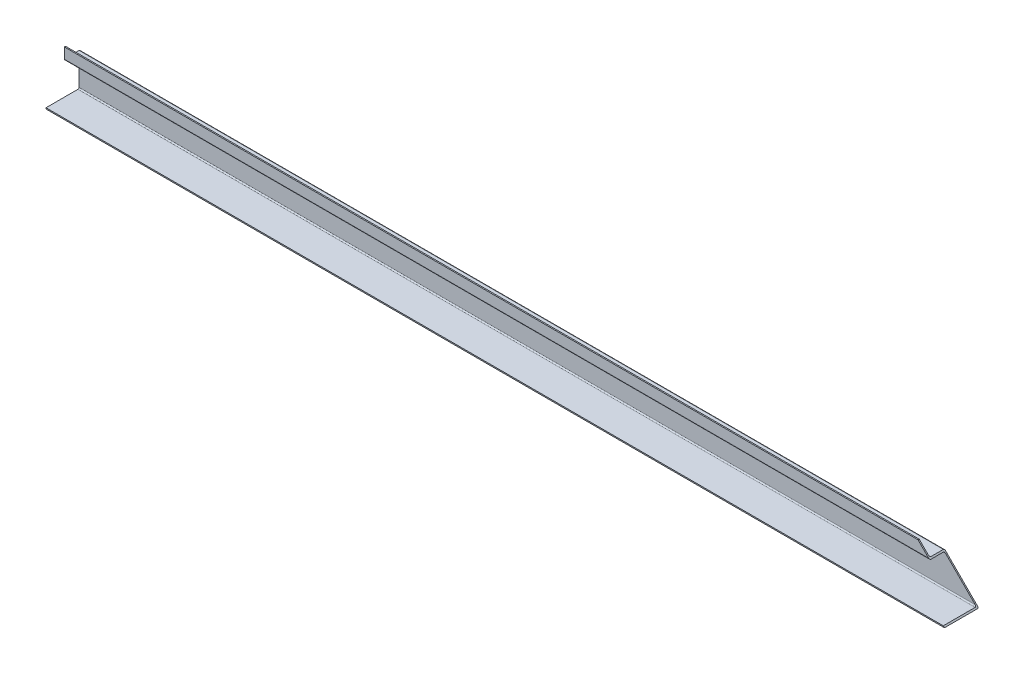
ISO-10303-21;
HEADER;
FILE_DESCRIPTION(('STEP AP214'),'2;1');
FILE_NAME('part.step','',(''),(''),'','','');
FILE_SCHEMA(('AUTOMOTIVE_DESIGN { 1 0 10303 214 1 1 1 1 }'));
ENDSEC;
DATA;
#1=APPLICATION_CONTEXT('core data for automotive mechanical design processes');
#2=APPLICATION_PROTOCOL_DEFINITION('international standard','automotive_design',2000,#1);
#3=PRODUCT_CONTEXT('',#1,'mechanical');
#4=PRODUCT('Part','Part','',(#3));
#5=PRODUCT_RELATED_PRODUCT_CATEGORY('part','',(#4));
#6=PRODUCT_DEFINITION_FORMATION('','',#4);
#7=PRODUCT_DEFINITION_CONTEXT('part definition',#1,'design');
#8=PRODUCT_DEFINITION('design','',#6,#7);
#9=PRODUCT_DEFINITION_SHAPE('','',#8);
#10=(LENGTH_UNIT() NAMED_UNIT(*) SI_UNIT(.MILLI.,.METRE.));
#11=(NAMED_UNIT(*) PLANE_ANGLE_UNIT() SI_UNIT($,.RADIAN.));
#12=(NAMED_UNIT(*) SI_UNIT($,.STERADIAN.) SOLID_ANGLE_UNIT());
#13=UNCERTAINTY_MEASURE_WITH_UNIT(LENGTH_MEASURE(1.E-05),#10,'distance_accuracy_value','');
#14=(GEOMETRIC_REPRESENTATION_CONTEXT(3) GLOBAL_UNCERTAINTY_ASSIGNED_CONTEXT((#13)) GLOBAL_UNIT_ASSIGNED_CONTEXT((#10,
#11,#12)) REPRESENTATION_CONTEXT('',''));
#15=CARTESIAN_POINT('',(0.,0.,0.));
#16=DIRECTION('',(0.,0.,1.));
#17=DIRECTION('',(1.,0.,0.));
#18=AXIS2_PLACEMENT_3D('',#15,#16,#17);
#19=CARTESIAN_POINT('',(2310.,0.,0.));
#20=DIRECTION('',(0.,0.,-1.));
#21=DIRECTION('',(-1.,0.,0.));
#22=AXIS2_PLACEMENT_3D('',#19,#20,#21);
#23=PLANE('',#22);
#24=DIRECTION('',(-1.,0.,0.));
#25=VECTOR('',#24,1.);
#26=CARTESIAN_POINT('',(2310.,-3.,0.));
#27=LINE('',#26,#25);
#28=CARTESIAN_POINT('',(2310.,-3.,0.));
#29=VERTEX_POINT('',#28);
#30=CARTESIAN_POINT('',(0.,-3.,0.));
#31=VERTEX_POINT('',#30);
#32=EDGE_CURVE('E161',#29,#31,#27,.T.);
#33=ORIENTED_EDGE('',*,*,#32,.F.);
#34=DIRECTION('',(-0.707106781186551,0.707106781186544,0.));
#35=VECTOR('',#34,1.);
#36=CARTESIAN_POINT('',(2310.,-3.,0.));
#37=LINE('',#36,#35);
#38=CARTESIAN_POINT('',(2307.,0.,0.));
#39=VERTEX_POINT('',#38);
#40=EDGE_CURVE('E144',#29,#39,#37,.T.);
#41=ORIENTED_EDGE('',*,*,#40,.T.);
#42=DIRECTION('',(-1.,0.,0.));
#43=VECTOR('',#42,1.);
#44=CARTESIAN_POINT('',(2310.,0.,0.));
#45=LINE('',#44,#43);
#46=CARTESIAN_POINT('',(0.,0.,0.));
#47=VERTEX_POINT('',#46);
#48=EDGE_CURVE('E165',#39,#47,#45,.T.);
#49=ORIENTED_EDGE('',*,*,#48,.T.);
#50=DIRECTION('',(0.,-1.,0.));
#51=VECTOR('',#50,1.);
#52=CARTESIAN_POINT('',(0.,0.,0.));
#53=LINE('',#52,#51);
#54=EDGE_CURVE('E169',#47,#31,#53,.T.);
#55=ORIENTED_EDGE('',*,*,#54,.T.);
#56=EDGE_LOOP('',(#33,#41,#49,#55));
#57=FACE_BOUND('',#56,.T.);
#58=ADVANCED_FACE('F33',(#57),#23,.F.);
#59=CARTESIAN_POINT('',(2310.,-3.,0.));
#60=DIRECTION('',(0.,1.,0.));
#61=DIRECTION('',(0.,0.,1.));
#62=AXIS2_PLACEMENT_3D('',#59,#60,#61);
#63=PLANE('',#62);
#64=DIRECTION('',(0.,0.,-1.));
#65=VECTOR('',#64,1.);
#66=CARTESIAN_POINT('',(0.,-3.,0.));
#67=LINE('',#66,#65);
#68=CARTESIAN_POINT('',(0.,-3.,-85.));
#69=VERTEX_POINT('',#68);
#70=EDGE_CURVE('E253',#31,#69,#67,.T.);
#71=ORIENTED_EDGE('',*,*,#70,.T.);
#72=DIRECTION('',(-1.,0.,0.));
#73=VECTOR('',#72,1.);
#74=CARTESIAN_POINT('',(2310.,-3.,-85.));
#75=LINE('',#74,#73);
#76=CARTESIAN_POINT('',(2310.,-3.,-85.));
#77=VERTEX_POINT('',#76);
#78=EDGE_CURVE('E164',#69,#77,#75,.F.);
#79=ORIENTED_EDGE('',*,*,#78,.T.);
#80=DIRECTION('',(0.,0.,-1.));
#81=VECTOR('',#80,1.);
#82=CARTESIAN_POINT('',(2310.,-3.,0.));
#83=LINE('',#82,#81);
#84=EDGE_CURVE('E147',#29,#77,#83,.T.);
#85=ORIENTED_EDGE('',*,*,#84,.F.);
#86=ORIENTED_EDGE('',*,*,#32,.T.);
#87=EDGE_LOOP('',(#71,#79,#85,#86));
#88=FACE_BOUND('',#87,.T.);
#89=ADVANCED_FACE('F160',(#88),#63,.F.);
#90=CARTESIAN_POINT('',(2310.,-3.,-88.));
#91=DIRECTION('',(0.,0.,1.));
#92=DIRECTION('',(1.,0.,0.));
#93=AXIS2_PLACEMENT_3D('',#90,#91,#92);
#94=PLANE('',#93);
#95=DIRECTION('',(-1.,0.,0.));
#96=VECTOR('',#95,1.);
#97=CARTESIAN_POINT('',(2310.,82.,-88.));
#98=LINE('',#97,#96);
#99=CARTESIAN_POINT('',(0.,82.,-88.));
#100=VERTEX_POINT('',#99);
#101=CARTESIAN_POINT('',(2225.,82.,-88.));
#102=VERTEX_POINT('',#101);
#103=EDGE_CURVE('E170',#100,#102,#98,.F.);
#104=ORIENTED_EDGE('',*,*,#103,.T.);
#105=DIRECTION('',(-0.707106781186551,0.707106781186544,0.));
#106=VECTOR('',#105,1.);
#107=CARTESIAN_POINT('',(2310.,-3.,-88.));
#108=LINE('',#107,#106);
#109=CARTESIAN_POINT('',(2307.,0.,-88.));
#110=VERTEX_POINT('',#109);
#111=EDGE_CURVE('E155',#110,#102,#108,.T.);
#112=ORIENTED_EDGE('',*,*,#111,.F.);
#113=DIRECTION('',(-1.,0.,0.));
#114=VECTOR('',#113,1.);
#115=CARTESIAN_POINT('',(2310.,0.,-88.));
#116=LINE('',#115,#114);
#117=CARTESIAN_POINT('',(0.,0.,-88.));
#118=VERTEX_POINT('',#117);
#119=EDGE_CURVE('E174',#110,#118,#116,.T.);
#120=ORIENTED_EDGE('',*,*,#119,.T.);
#121=DIRECTION('',(0.,1.,0.));
#122=VECTOR('',#121,1.);
#123=CARTESIAN_POINT('',(0.,-3.,-88.));
#124=LINE('',#123,#122);
#125=EDGE_CURVE('E255',#118,#100,#124,.T.);
#126=ORIENTED_EDGE('',*,*,#125,.T.);
#127=EDGE_LOOP('',(#104,#112,#120,#126));
#128=FACE_BOUND('',#127,.T.);
#129=ADVANCED_FACE('F315',(#128),#94,.F.);
#130=CARTESIAN_POINT('',(2310.,85.,-88.));
#131=DIRECTION('',(0.,-1.,0.));
#132=DIRECTION('',(0.,0.,-1.));
#133=AXIS2_PLACEMENT_3D('',#130,#131,#132);
#134=PLANE('',#133);
#135=DIRECTION('',(-1.,0.,0.));
#136=VECTOR('',#135,1.);
#137=CARTESIAN_POINT('',(2310.,85.,-53.));
#138=LINE('',#137,#136);
#139=CARTESIAN_POINT('',(0.,85.,-53.));
#140=VERTEX_POINT('',#139);
#141=CARTESIAN_POINT('',(2222.,85.,-53.));
#142=VERTEX_POINT('',#141);
#143=EDGE_CURVE('E187',#140,#142,#138,.F.);
#144=ORIENTED_EDGE('',*,*,#143,.T.);
#145=DIRECTION('',(0.,0.,-1.));
#146=VECTOR('',#145,1.);
#147=CARTESIAN_POINT('',(2222.,85.,-88.));
#148=LINE('',#147,#146);
#149=CARTESIAN_POINT('',(2222.,85.,-85.));
#150=VERTEX_POINT('',#149);
#151=EDGE_CURVE('E245',#142,#150,#148,.T.);
#152=ORIENTED_EDGE('',*,*,#151,.T.);
#153=DIRECTION('',(-1.,0.,0.));
#154=VECTOR('',#153,1.);
#155=CARTESIAN_POINT('',(2310.,85.,-85.));
#156=LINE('',#155,#154);
#157=CARTESIAN_POINT('',(0.,85.,-85.));
#158=VERTEX_POINT('',#157);
#159=EDGE_CURVE('E190',#150,#158,#156,.T.);
#160=ORIENTED_EDGE('',*,*,#159,.T.);
#161=DIRECTION('',(0.,0.,1.));
#162=VECTOR('',#161,1.);
#163=CARTESIAN_POINT('',(0.,85.,-88.));
#164=LINE('',#163,#162);
#165=EDGE_CURVE('E258',#158,#140,#164,.T.);
#166=ORIENTED_EDGE('',*,*,#165,.T.);
#167=EDGE_LOOP('',(#144,#152,#160,#166));
#168=FACE_BOUND('',#167,.T.);
#169=ADVANCED_FACE('F338',(#168),#134,.F.);
#170=CARTESIAN_POINT('',(2310.,85.,-50.));
#171=DIRECTION('',(0.,0.,1.));
#172=DIRECTION('',(1.,0.,0.));
#173=AXIS2_PLACEMENT_3D('',#170,#171,#172);
#174=PLANE('',#173);
#175=DIRECTION('',(-1.,0.,0.));
#176=VECTOR('',#175,1.);
#177=CARTESIAN_POINT('',(2310.,112.,-50.));
#178=LINE('',#177,#176);
#179=CARTESIAN_POINT('',(2195.,112.,-50.));
#180=VERTEX_POINT('',#179);
#181=CARTESIAN_POINT('',(0.,112.,-50.));
#182=VERTEX_POINT('',#181);
#183=EDGE_CURVE('E171',#180,#182,#178,.T.);
#184=ORIENTED_EDGE('',*,*,#183,.F.);
#185=DIRECTION('',(0.707106781186551,-0.707106781186544,0.));
#186=VECTOR('',#185,1.);
#187=CARTESIAN_POINT('',(2266.,40.9999999999996,-50.));
#188=LINE('',#187,#186);
#189=CARTESIAN_POINT('',(2219.,88.,-50.));
#190=VERTEX_POINT('',#189);
#191=EDGE_CURVE('E242',#180,#190,#188,.T.);
#192=ORIENTED_EDGE('',*,*,#191,.T.);
#193=DIRECTION('',(-1.,0.,0.));
#194=VECTOR('',#193,1.);
#195=CARTESIAN_POINT('',(0.,88.,-50.));
#196=LINE('',#195,#194);
#197=CARTESIAN_POINT('',(0.,88.,-50.));
#198=VERTEX_POINT('',#197);
#199=EDGE_CURVE('E192',#190,#198,#196,.T.);
#200=ORIENTED_EDGE('',*,*,#199,.T.);
#201=DIRECTION('',(0.,1.,0.));
#202=VECTOR('',#201,1.);
#203=CARTESIAN_POINT('',(0.,85.,-50.));
#204=LINE('',#203,#202);
#205=EDGE_CURVE('E261',#198,#182,#204,.T.);
#206=ORIENTED_EDGE('',*,*,#205,.T.);
#207=EDGE_LOOP('',(#184,#192,#200,#206));
#208=FACE_BOUND('',#207,.T.);
#209=ADVANCED_FACE('F341',(#208),#174,.F.);
#210=CARTESIAN_POINT('',(2310.,112.,-47.));
#211=DIRECTION('',(0.,-1.,0.));
#212=DIRECTION('',(0.,0.,-1.));
#213=AXIS2_PLACEMENT_3D('',#210,#211,#212);
#214=PLANE('',#213);
#215=DIRECTION('',(-1.,0.,0.));
#216=VECTOR('',#215,1.);
#217=CARTESIAN_POINT('',(2310.,112.,-47.));
#218=LINE('',#217,#216);
#219=CARTESIAN_POINT('',(2195.,112.,-47.));
#220=VERTEX_POINT('',#219);
#221=CARTESIAN_POINT('',(0.,112.,-47.));
#222=VERTEX_POINT('',#221);
#223=EDGE_CURVE('E176',#220,#222,#218,.T.);
#224=ORIENTED_EDGE('',*,*,#223,.F.);
#225=DIRECTION('',(0.,0.,-1.));
#226=VECTOR('',#225,1.);
#227=CARTESIAN_POINT('',(2195.,112.,0.));
#228=LINE('',#227,#226);
#229=EDGE_CURVE('E154',#220,#180,#228,.T.);
#230=ORIENTED_EDGE('',*,*,#229,.T.);
#231=ORIENTED_EDGE('',*,*,#183,.T.);
#232=DIRECTION('',(0.,0.,1.));
#233=VECTOR('',#232,1.);
#234=CARTESIAN_POINT('',(0.,112.,-47.));
#235=LINE('',#234,#233);
#236=EDGE_CURVE('E264',#182,#222,#235,.T.);
#237=ORIENTED_EDGE('',*,*,#236,.T.);
#238=EDGE_LOOP('',(#224,#230,#231,#237));
#239=FACE_BOUND('',#238,.T.);
#240=ADVANCED_FACE('F281',(#239),#214,.F.);
#241=CARTESIAN_POINT('',(2310.,82.,-47.));
#242=DIRECTION('',(0.,0.,-1.));
#243=DIRECTION('',(-1.,0.,0.));
#244=AXIS2_PLACEMENT_3D('',#241,#242,#243);
#245=PLANE('',#244);
#246=DIRECTION('',(-1.,0.,0.));
#247=VECTOR('',#246,1.);
#248=CARTESIAN_POINT('',(2310.,85.,-47.));
#249=LINE('',#248,#247);
#250=CARTESIAN_POINT('',(0.,85.,-47.));
#251=VERTEX_POINT('',#250);
#252=CARTESIAN_POINT('',(2222.,85.,-47.));
#253=VERTEX_POINT('',#252);
#254=EDGE_CURVE('E206',#251,#253,#249,.F.);
#255=ORIENTED_EDGE('',*,*,#254,.T.);
#256=DIRECTION('',(-0.707106781186551,0.707106781186544,0.));
#257=VECTOR('',#256,1.);
#258=CARTESIAN_POINT('',(2267.5,39.4999999999996,-47.));
#259=LINE('',#258,#257);
#260=EDGE_CURVE('E47',#253,#220,#259,.T.);
#261=ORIENTED_EDGE('',*,*,#260,.T.);
#262=ORIENTED_EDGE('',*,*,#223,.T.);
#263=DIRECTION('',(0.,-1.,0.));
#264=VECTOR('',#263,1.);
#265=CARTESIAN_POINT('',(0.,82.,-47.));
#266=LINE('',#265,#264);
#267=EDGE_CURVE('E267',#222,#251,#266,.T.);
#268=ORIENTED_EDGE('',*,*,#267,.T.);
#269=EDGE_LOOP('',(#255,#261,#262,#268));
#270=FACE_BOUND('',#269,.T.);
#271=ADVANCED_FACE('F275',(#270),#245,.F.);
#272=CARTESIAN_POINT('',(2310.,82.,-85.));
#273=DIRECTION('',(0.,1.,0.));
#274=DIRECTION('',(0.,0.,1.));
#275=AXIS2_PLACEMENT_3D('',#272,#273,#274);
#276=PLANE('',#275);
#277=DIRECTION('',(-1.,0.,0.));
#278=VECTOR('',#277,1.);
#279=CARTESIAN_POINT('',(2310.,82.,-82.));
#280=LINE('',#279,#278);
#281=CARTESIAN_POINT('',(0.,82.,-82.));
#282=VERTEX_POINT('',#281);
#283=CARTESIAN_POINT('',(2225.,82.,-82.));
#284=VERTEX_POINT('',#283);
#285=EDGE_CURVE('E201',#282,#284,#280,.F.);
#286=ORIENTED_EDGE('',*,*,#285,.T.);
#287=DIRECTION('',(0.,0.,1.));
#288=VECTOR('',#287,1.);
#289=CARTESIAN_POINT('',(2225.,82.,-85.));
#290=LINE('',#289,#288);
#291=CARTESIAN_POINT('',(2225.,82.,-50.));
#292=VERTEX_POINT('',#291);
#293=EDGE_CURVE('E289',#284,#292,#290,.T.);
#294=ORIENTED_EDGE('',*,*,#293,.T.);
#295=DIRECTION('',(-1.,0.,0.));
#296=VECTOR('',#295,1.);
#297=CARTESIAN_POINT('',(2310.,82.,-50.));
#298=LINE('',#297,#296);
#299=CARTESIAN_POINT('',(0.,82.,-50.));
#300=VERTEX_POINT('',#299);
#301=EDGE_CURVE('E199',#292,#300,#298,.T.);
#302=ORIENTED_EDGE('',*,*,#301,.T.);
#303=DIRECTION('',(0.,0.,-1.));
#304=VECTOR('',#303,1.);
#305=CARTESIAN_POINT('',(0.,82.,-85.));
#306=LINE('',#305,#304);
#307=EDGE_CURVE('E227',#300,#282,#306,.T.);
#308=ORIENTED_EDGE('',*,*,#307,.T.);
#309=EDGE_LOOP('',(#286,#294,#302,#308));
#310=FACE_BOUND('',#309,.T.);
#311=ADVANCED_FACE('F292',(#310),#276,.F.);
#312=CARTESIAN_POINT('',(2310.,0.,-85.));
#313=DIRECTION('',(0.,0.,-1.));
#314=DIRECTION('',(-1.,0.,0.));
#315=AXIS2_PLACEMENT_3D('',#312,#313,#314);
#316=PLANE('',#315);
#317=DIRECTION('',(-1.,0.,0.));
#318=VECTOR('',#317,1.);
#319=CARTESIAN_POINT('',(2310.,3.,-85.));
#320=LINE('',#319,#318);
#321=CARTESIAN_POINT('',(0.,3.,-85.));
#322=VERTEX_POINT('',#321);
#323=CARTESIAN_POINT('',(2304.,3.,-85.));
#324=VERTEX_POINT('',#323);
#325=EDGE_CURVE('E194',#322,#324,#320,.F.);
#326=ORIENTED_EDGE('',*,*,#325,.T.);
#327=DIRECTION('',(-0.707106781186551,0.707106781186544,0.));
#328=VECTOR('',#327,1.);
#329=CARTESIAN_POINT('',(2308.5,-1.50000000000001,-85.));
#330=LINE('',#329,#328);
#331=CARTESIAN_POINT('',(2228.,79.,-85.));
#332=VERTEX_POINT('',#331);
#333=EDGE_CURVE('E232',#324,#332,#330,.T.);
#334=ORIENTED_EDGE('',*,*,#333,.T.);
#335=DIRECTION('',(-1.,0.,0.));
#336=VECTOR('',#335,1.);
#337=CARTESIAN_POINT('',(0.,79.,-85.));
#338=LINE('',#337,#336);
#339=CARTESIAN_POINT('',(0.,79.,-85.));
#340=VERTEX_POINT('',#339);
#341=EDGE_CURVE('E197',#332,#340,#338,.T.);
#342=ORIENTED_EDGE('',*,*,#341,.T.);
#343=DIRECTION('',(0.,-1.,0.));
#344=VECTOR('',#343,1.);
#345=CARTESIAN_POINT('',(0.,0.,-85.));
#346=LINE('',#345,#344);
#347=EDGE_CURVE('E217',#340,#322,#346,.T.);
#348=ORIENTED_EDGE('',*,*,#347,.T.);
#349=EDGE_LOOP('',(#326,#334,#342,#348));
#350=FACE_BOUND('',#349,.T.);
#351=ADVANCED_FACE('F223',(#350),#316,.F.);
#352=CARTESIAN_POINT('',(2310.,0.,0.));
#353=DIRECTION('',(0.,-1.,0.));
#354=DIRECTION('',(0.,0.,-1.));
#355=AXIS2_PLACEMENT_3D('',#352,#353,#354);
#356=PLANE('',#355);
#357=ORIENTED_EDGE('',*,*,#48,.F.);
#358=DIRECTION('',(0.,0.,-1.));
#359=VECTOR('',#358,1.);
#360=CARTESIAN_POINT('',(2307.,0.,0.));
#361=LINE('',#360,#359);
#362=CARTESIAN_POINT('',(2307.,0.,-82.));
#363=VERTEX_POINT('',#362);
#364=EDGE_CURVE('E150',#39,#363,#361,.T.);
#365=ORIENTED_EDGE('',*,*,#364,.T.);
#366=DIRECTION('',(-1.,0.,0.));
#367=VECTOR('',#366,1.);
#368=CARTESIAN_POINT('',(0.,0.,-82.));
#369=LINE('',#368,#367);
#370=CARTESIAN_POINT('',(0.,0.,-82.));
#371=VERTEX_POINT('',#370);
#372=EDGE_CURVE('E204',#363,#371,#369,.T.);
#373=ORIENTED_EDGE('',*,*,#372,.T.);
#374=DIRECTION('',(0.,0.,1.));
#375=VECTOR('',#374,1.);
#376=CARTESIAN_POINT('',(0.,0.,0.));
#377=LINE('',#376,#375);
#378=EDGE_CURVE('E166',#371,#47,#377,.T.);
#379=ORIENTED_EDGE('',*,*,#378,.T.);
#380=EDGE_LOOP('',(#357,#365,#373,#379));
#381=FACE_BOUND('',#380,.T.);
#382=ADVANCED_FACE('F394',(#381),#356,.F.);
#383=CARTESIAN_POINT('',(0.,0.,0.));
#384=DIRECTION('',(1.,0.,0.));
#385=DIRECTION('',(0.,0.,-1.));
#386=AXIS2_PLACEMENT_3D('',#383,#384,#385);
#387=PLANE('',#386);
#388=ORIENTED_EDGE('',*,*,#125,.F.);
#389=CARTESIAN_POINT('',(0.,0.,-85.));
#390=DIRECTION('',(1.,0.,0.));
#391=DIRECTION('',(0.,0.,-1.));
#392=AXIS2_PLACEMENT_3D('',#389,#390,#391);
#393=CIRCLE('',#392,3.);
#394=EDGE_CURVE('E55',#118,#69,#393,.F.);
#395=ORIENTED_EDGE('',*,*,#394,.T.);
#396=ORIENTED_EDGE('',*,*,#70,.F.);
#397=ORIENTED_EDGE('',*,*,#54,.F.);
#398=ORIENTED_EDGE('',*,*,#378,.F.);
#399=CARTESIAN_POINT('',(0.,3.,-82.));
#400=DIRECTION('',(1.,0.,0.));
#401=DIRECTION('',(0.,0.,-1.));
#402=AXIS2_PLACEMENT_3D('',#399,#400,#401);
#403=CIRCLE('',#402,3.);
#404=EDGE_CURVE('E41',#371,#322,#403,.T.);
#405=ORIENTED_EDGE('',*,*,#404,.T.);
#406=ORIENTED_EDGE('',*,*,#347,.F.);
#407=CARTESIAN_POINT('',(0.,79.,-82.));
#408=DIRECTION('',(1.,0.,0.));
#409=DIRECTION('',(0.,0.,-1.));
#410=AXIS2_PLACEMENT_3D('',#407,#408,#409);
#411=CIRCLE('',#410,3.);
#412=EDGE_CURVE('E211',#340,#282,#411,.T.);
#413=ORIENTED_EDGE('',*,*,#412,.T.);
#414=ORIENTED_EDGE('',*,*,#307,.F.);
#415=CARTESIAN_POINT('',(0.,85.,-50.));
#416=DIRECTION('',(1.,0.,0.));
#417=DIRECTION('',(0.,0.,-1.));
#418=AXIS2_PLACEMENT_3D('',#415,#416,#417);
#419=CIRCLE('',#418,3.);
#420=EDGE_CURVE('E181',#300,#251,#419,.F.);
#421=ORIENTED_EDGE('',*,*,#420,.T.);
#422=ORIENTED_EDGE('',*,*,#267,.F.);
#423=ORIENTED_EDGE('',*,*,#236,.F.);
#424=ORIENTED_EDGE('',*,*,#205,.F.);
#425=CARTESIAN_POINT('',(0.,88.,-53.));
#426=DIRECTION('',(1.,0.,0.));
#427=DIRECTION('',(0.,0.,-1.));
#428=AXIS2_PLACEMENT_3D('',#425,#426,#427);
#429=CIRCLE('',#428,3.);
#430=EDGE_CURVE('E209',#198,#140,#429,.T.);
#431=ORIENTED_EDGE('',*,*,#430,.T.);
#432=ORIENTED_EDGE('',*,*,#165,.F.);
#433=CARTESIAN_POINT('',(0.,82.,-85.));
#434=DIRECTION('',(1.,0.,0.));
#435=DIRECTION('',(0.,0.,-1.));
#436=AXIS2_PLACEMENT_3D('',#433,#434,#435);
#437=CIRCLE('',#436,3.);
#438=EDGE_CURVE('E183',#158,#100,#437,.F.);
#439=ORIENTED_EDGE('',*,*,#438,.T.);
#440=EDGE_LOOP('',(#388,#395,#396,#397,#398,#405,#406,#413,#414,#421,#422,#423,#424,#431,#432,#439));
#441=FACE_BOUND('',#440,.T.);
#442=ADVANCED_FACE('F216',(#441),#387,.F.);
#443=CARTESIAN_POINT('',(2310.,0.,-85.));
#444=DIRECTION('',(-1.,0.,0.));
#445=DIRECTION('',(0.,0.,1.));
#446=AXIS2_PLACEMENT_3D('',#443,#444,#445);
#447=CYLINDRICAL_SURFACE('',#446,3.);
#448=CARTESIAN_POINT('',(2307.,0.,-85.));
#449=DIRECTION('',(-0.707106781186544,-0.707106781186551,0.));
#450=DIRECTION('',(-0.707106781186551,0.707106781186544,0.));
#451=AXIS2_PLACEMENT_3D('',#448,#449,#450);
#452=ELLIPSE('',#451,4.24264068711931,3.);
#453=EDGE_CURVE('E250',#77,#110,#452,.F.);
#454=ORIENTED_EDGE('',*,*,#453,.F.);
#455=ORIENTED_EDGE('',*,*,#78,.F.);
#456=ORIENTED_EDGE('',*,*,#394,.F.);
#457=ORIENTED_EDGE('',*,*,#119,.F.);
#458=EDGE_LOOP('',(#454,#455,#456,#457));
#459=FACE_BOUND('',#458,.T.);
#460=ADVANCED_FACE('F319',(#459),#447,.T.);
#461=CARTESIAN_POINT('',(2310.,82.,-85.));
#462=DIRECTION('',(-1.,0.,0.));
#463=DIRECTION('',(0.,0.,1.));
#464=AXIS2_PLACEMENT_3D('',#461,#462,#463);
#465=CYLINDRICAL_SURFACE('',#464,3.);
#466=CARTESIAN_POINT('',(2225.,82.,-85.));
#467=DIRECTION('',(-0.707106781186544,-0.707106781186551,0.));
#468=DIRECTION('',(-0.707106781186551,0.707106781186544,0.));
#469=AXIS2_PLACEMENT_3D('',#466,#467,#468);
#470=ELLIPSE('',#469,4.24264068711931,3.);
#471=EDGE_CURVE('E248',#102,#150,#470,.F.);
#472=ORIENTED_EDGE('',*,*,#471,.F.);
#473=ORIENTED_EDGE('',*,*,#103,.F.);
#474=ORIENTED_EDGE('',*,*,#438,.F.);
#475=ORIENTED_EDGE('',*,*,#159,.F.);
#476=EDGE_LOOP('',(#472,#473,#474,#475));
#477=FACE_BOUND('',#476,.T.);
#478=ADVANCED_FACE('F307',(#477),#465,.T.);
#479=CARTESIAN_POINT('',(2310.,88.,-53.));
#480=DIRECTION('',(1.,0.,0.));
#481=DIRECTION('',(0.,0.,-1.));
#482=AXIS2_PLACEMENT_3D('',#479,#480,#481);
#483=CYLINDRICAL_SURFACE('',#482,3.);
#484=ORIENTED_EDGE('',*,*,#199,.F.);
#485=CARTESIAN_POINT('',(2219.,88.,-53.));
#486=DIRECTION('',(-0.707106781186544,-0.707106781186551,0.));
#487=DIRECTION('',(0.707106781186551,-0.707106781186544,0.));
#488=AXIS2_PLACEMENT_3D('',#485,#486,#487);
#489=ELLIPSE('',#488,4.24264068711931,3.);
#490=EDGE_CURVE('E234',#190,#142,#489,.F.);
#491=ORIENTED_EDGE('',*,*,#490,.T.);
#492=ORIENTED_EDGE('',*,*,#143,.F.);
#493=ORIENTED_EDGE('',*,*,#430,.F.);
#494=EDGE_LOOP('',(#484,#491,#492,#493));
#495=FACE_BOUND('',#494,.T.);
#496=ADVANCED_FACE('F301',(#495),#483,.F.);
#497=CARTESIAN_POINT('',(2310.,79.,-82.));
#498=DIRECTION('',(1.,0.,0.));
#499=DIRECTION('',(0.,0.,-1.));
#500=AXIS2_PLACEMENT_3D('',#497,#498,#499);
#501=CYLINDRICAL_SURFACE('',#500,3.);
#502=ORIENTED_EDGE('',*,*,#341,.F.);
#503=CARTESIAN_POINT('',(2228.,79.,-82.));
#504=DIRECTION('',(-0.707106781186544,-0.707106781186551,0.));
#505=DIRECTION('',(0.707106781186551,-0.707106781186544,0.));
#506=AXIS2_PLACEMENT_3D('',#503,#504,#505);
#507=ELLIPSE('',#506,4.24264068711931,3.);
#508=EDGE_CURVE('E236',#332,#284,#507,.F.);
#509=ORIENTED_EDGE('',*,*,#508,.T.);
#510=ORIENTED_EDGE('',*,*,#285,.F.);
#511=ORIENTED_EDGE('',*,*,#412,.F.);
#512=EDGE_LOOP('',(#502,#509,#510,#511));
#513=FACE_BOUND('',#512,.T.);
#514=ADVANCED_FACE('F299',(#513),#501,.F.);
#515=CARTESIAN_POINT('',(2310.,3.,-82.));
#516=DIRECTION('',(1.,0.,0.));
#517=DIRECTION('',(0.,0.,-1.));
#518=AXIS2_PLACEMENT_3D('',#515,#516,#517);
#519=CYLINDRICAL_SURFACE('',#518,3.);
#520=ORIENTED_EDGE('',*,*,#372,.F.);
#521=CARTESIAN_POINT('',(2304.,3.,-82.));
#522=DIRECTION('',(-0.707106781186544,-0.707106781186551,0.));
#523=DIRECTION('',(0.707106781186551,-0.707106781186544,0.));
#524=AXIS2_PLACEMENT_3D('',#521,#522,#523);
#525=ELLIPSE('',#524,4.24264068711931,3.);
#526=EDGE_CURVE('E231',#363,#324,#525,.F.);
#527=ORIENTED_EDGE('',*,*,#526,.T.);
#528=ORIENTED_EDGE('',*,*,#325,.F.);
#529=ORIENTED_EDGE('',*,*,#404,.F.);
#530=EDGE_LOOP('',(#520,#527,#528,#529));
#531=FACE_BOUND('',#530,.T.);
#532=ADVANCED_FACE('F230',(#531),#519,.F.);
#533=CARTESIAN_POINT('',(2310.,85.,-50.));
#534=DIRECTION('',(-1.,0.,0.));
#535=DIRECTION('',(0.,0.,1.));
#536=AXIS2_PLACEMENT_3D('',#533,#534,#535);
#537=CYLINDRICAL_SURFACE('',#536,3.);
#538=CARTESIAN_POINT('',(2222.,85.,-50.));
#539=DIRECTION('',(-0.707106781186544,-0.707106781186551,0.));
#540=DIRECTION('',(-0.707106781186551,0.707106781186544,0.));
#541=AXIS2_PLACEMENT_3D('',#538,#539,#540);
#542=ELLIPSE('',#541,4.24264068711931,3.);
#543=EDGE_CURVE('E11',#253,#292,#542,.F.);
#544=ORIENTED_EDGE('',*,*,#543,.F.);
#545=ORIENTED_EDGE('',*,*,#254,.F.);
#546=ORIENTED_EDGE('',*,*,#420,.F.);
#547=ORIENTED_EDGE('',*,*,#301,.F.);
#548=EDGE_LOOP('',(#544,#545,#546,#547));
#549=FACE_BOUND('',#548,.T.);
#550=ADVANCED_FACE('F35',(#549),#537,.T.);
#551=CARTESIAN_POINT('',(2310.,-3.,0.));
#552=DIRECTION('',(-0.707106781186544,-0.707106781186551,0.));
#553=DIRECTION('',(0.707106781186551,-0.707106781186544,0.));
#554=AXIS2_PLACEMENT_3D('',#551,#552,#553);
#555=PLANE('',#554);
#556=ORIENTED_EDGE('',*,*,#453,.T.);
#557=ORIENTED_EDGE('',*,*,#111,.T.);
#558=ORIENTED_EDGE('',*,*,#471,.T.);
#559=ORIENTED_EDGE('',*,*,#151,.F.);
#560=ORIENTED_EDGE('',*,*,#490,.F.);
#561=ORIENTED_EDGE('',*,*,#191,.F.);
#562=ORIENTED_EDGE('',*,*,#229,.F.);
#563=ORIENTED_EDGE('',*,*,#260,.F.);
#564=ORIENTED_EDGE('',*,*,#543,.T.);
#565=ORIENTED_EDGE('',*,*,#293,.F.);
#566=ORIENTED_EDGE('',*,*,#508,.F.);
#567=ORIENTED_EDGE('',*,*,#333,.F.);
#568=ORIENTED_EDGE('',*,*,#526,.F.);
#569=ORIENTED_EDGE('',*,*,#364,.F.);
#570=ORIENTED_EDGE('',*,*,#40,.F.);
#571=ORIENTED_EDGE('',*,*,#84,.T.);
#572=EDGE_LOOP('',(#556,#557,#558,#559,#560,#561,#562,#563,#564,#565,#566,#567,#568,#569,#570,#571));
#573=FACE_BOUND('',#572,.T.);
#574=ADVANCED_FACE('F146',(#573),#555,.F.);
#575=CLOSED_SHELL('',(#58,#89,#129,#169,#209,#240,#271,#311,#351,#382,#442,#460,#478,#496,#514,
#532,#550,#574));
#576=MANIFOLD_SOLID_BREP('B2',#575);
#577=ADVANCED_BREP_SHAPE_REPRESENTATION('',(#18,#576),#14);
#578=SHAPE_DEFINITION_REPRESENTATION(#9,#577);
ENDSEC;
END-ISO-10303-21;
